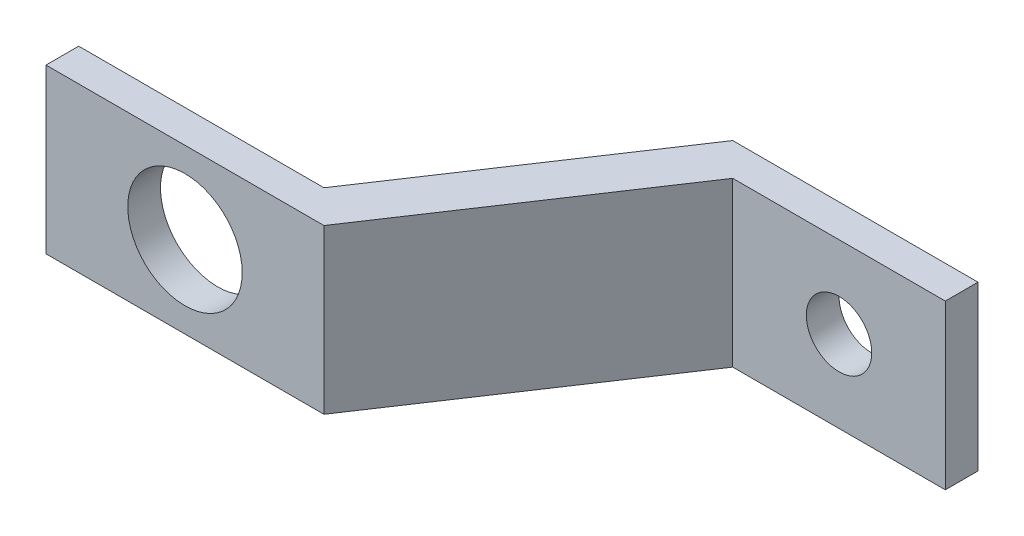
ISO-10303-21;
HEADER;
FILE_DESCRIPTION(('STEP AP214'),'2;1');
FILE_NAME('part.step','',(''),(''),'','','');
FILE_SCHEMA(('AUTOMOTIVE_DESIGN { 1 0 10303 214 1 1 1 1 }'));
ENDSEC;
DATA;
#1=APPLICATION_CONTEXT('core data for automotive mechanical design processes');
#2=APPLICATION_PROTOCOL_DEFINITION('international standard','automotive_design',2000,#1);
#3=PRODUCT_CONTEXT('',#1,'mechanical');
#4=PRODUCT('Part','Part','',(#3));
#5=PRODUCT_RELATED_PRODUCT_CATEGORY('part','',(#4));
#6=PRODUCT_DEFINITION_FORMATION('','',#4);
#7=PRODUCT_DEFINITION_CONTEXT('part definition',#1,'design');
#8=PRODUCT_DEFINITION('design','',#6,#7);
#9=PRODUCT_DEFINITION_SHAPE('','',#8);
#10=(LENGTH_UNIT() NAMED_UNIT(*) SI_UNIT(.MILLI.,.METRE.));
#11=(NAMED_UNIT(*) PLANE_ANGLE_UNIT() SI_UNIT($,.RADIAN.));
#12=(NAMED_UNIT(*) SI_UNIT($,.STERADIAN.) SOLID_ANGLE_UNIT());
#13=UNCERTAINTY_MEASURE_WITH_UNIT(LENGTH_MEASURE(1.E-05),#10,'distance_accuracy_value','');
#14=(GEOMETRIC_REPRESENTATION_CONTEXT(3) GLOBAL_UNCERTAINTY_ASSIGNED_CONTEXT((#13)) GLOBAL_UNIT_ASSIGNED_CONTEXT((#10,
#11,#12)) REPRESENTATION_CONTEXT('',''));
#15=CARTESIAN_POINT('',(0.,0.,0.));
#16=DIRECTION('',(0.,0.,1.));
#17=DIRECTION('',(1.,0.,0.));
#18=AXIS2_PLACEMENT_3D('',#15,#16,#17);
#19=CARTESIAN_POINT('',(0.,10.,2.));
#20=DIRECTION('',(1.,0.,0.));
#21=DIRECTION('',(0.,0.,-1.));
#22=AXIS2_PLACEMENT_3D('',#19,#20,#21);
#23=PLANE('',#22);
#24=DIRECTION('',(0.,0.,1.));
#25=VECTOR('',#24,1.);
#26=CARTESIAN_POINT('',(0.,0.,2.));
#27=LINE('',#26,#25);
#28=CARTESIAN_POINT('',(0.,0.,0.));
#29=VERTEX_POINT('',#28);
#30=CARTESIAN_POINT('',(0.,0.,2.));
#31=VERTEX_POINT('',#30);
#32=EDGE_CURVE('E140',#29,#31,#27,.T.);
#33=ORIENTED_EDGE('',*,*,#32,.T.);
#34=DIRECTION('',(0.,-1.,0.));
#35=VECTOR('',#34,1.);
#36=CARTESIAN_POINT('',(0.,10.,2.));
#37=LINE('',#36,#35);
#38=CARTESIAN_POINT('',(0.,10.,2.));
#39=VERTEX_POINT('',#38);
#40=EDGE_CURVE('E11',#39,#31,#37,.T.);
#41=ORIENTED_EDGE('',*,*,#40,.F.);
#42=DIRECTION('',(0.,0.,1.));
#43=VECTOR('',#42,1.);
#44=CARTESIAN_POINT('',(0.,10.,2.));
#45=LINE('',#44,#43);
#46=CARTESIAN_POINT('',(0.,10.,0.));
#47=VERTEX_POINT('',#46);
#48=EDGE_CURVE('E155',#47,#39,#45,.T.);
#49=ORIENTED_EDGE('',*,*,#48,.F.);
#50=DIRECTION('',(0.,-1.,0.));
#51=VECTOR('',#50,1.);
#52=CARTESIAN_POINT('',(0.,10.,0.));
#53=LINE('',#52,#51);
#54=EDGE_CURVE('E133',#47,#29,#53,.T.);
#55=ORIENTED_EDGE('',*,*,#54,.T.);
#56=EDGE_LOOP('',(#33,#41,#49,#55));
#57=FACE_BOUND('',#56,.T.);
#58=ADVANCED_FACE('F39',(#57),#23,.F.);
#59=CARTESIAN_POINT('',(17.,10.,2.));
#60=DIRECTION('',(0.,0.,-1.));
#61=DIRECTION('',(-1.,0.,0.));
#62=AXIS2_PLACEMENT_3D('',#59,#60,#61);
#63=PLANE('',#62);
#64=CARTESIAN_POINT('',(8.5,5.,2.));
#65=DIRECTION('',(0.,0.,1.));
#66=DIRECTION('',(1.,0.,0.));
#67=AXIS2_PLACEMENT_3D('',#64,#65,#66);
#68=CIRCLE('',#67,3.5);
#69=CARTESIAN_POINT('',(12.,5.,2.));
#70=VERTEX_POINT('',#69);
#71=EDGE_CURVE('E161',#70,#70,#68,.T.);
#72=ORIENTED_EDGE('',*,*,#71,.F.);
#73=EDGE_LOOP('',(#72));
#74=FACE_BOUND('',#73,.T.);
#75=DIRECTION('',(1.,0.,0.));
#76=VECTOR('',#75,1.);
#77=CARTESIAN_POINT('',(17.,0.,2.));
#78=LINE('',#77,#76);
#79=CARTESIAN_POINT('',(17.,0.,2.));
#80=VERTEX_POINT('',#79);
#81=EDGE_CURVE('E139',#31,#80,#78,.T.);
#82=ORIENTED_EDGE('',*,*,#81,.T.);
#83=DIRECTION('',(0.,-1.,0.));
#84=VECTOR('',#83,1.);
#85=CARTESIAN_POINT('',(17.,10.,2.));
#86=LINE('',#85,#84);
#87=CARTESIAN_POINT('',(17.,10.,2.));
#88=VERTEX_POINT('',#87);
#89=EDGE_CURVE('E48',#88,#80,#86,.T.);
#90=ORIENTED_EDGE('',*,*,#89,.F.);
#91=DIRECTION('',(1.,0.,0.));
#92=VECTOR('',#91,1.);
#93=CARTESIAN_POINT('',(17.,10.,2.));
#94=LINE('',#93,#92);
#95=EDGE_CURVE('E99',#39,#88,#94,.T.);
#96=ORIENTED_EDGE('',*,*,#95,.F.);
#97=ORIENTED_EDGE('',*,*,#40,.T.);
#98=EDGE_LOOP('',(#82,#90,#96,#97));
#99=FACE_BOUND('',#98,.T.);
#100=ADVANCED_FACE('F213',(#74,#99),#63,.F.);
#101=CARTESIAN_POINT('',(27.,10.,-13.));
#102=DIRECTION('',(-0.832050294337844,0.,-0.554700196225229));
#103=DIRECTION('',(-0.554700196225229,0.,0.832050294337844));
#104=AXIS2_PLACEMENT_3D('',#101,#102,#103);
#105=PLANE('',#104);
#106=DIRECTION('',(0.554700196225229,0.,-0.832050294337844));
#107=VECTOR('',#106,1.);
#108=CARTESIAN_POINT('',(27.,0.,-13.));
#109=LINE('',#108,#107);
#110=CARTESIAN_POINT('',(27.,0.,-13.));
#111=VERTEX_POINT('',#110);
#112=EDGE_CURVE('E142',#80,#111,#109,.T.);
#113=ORIENTED_EDGE('',*,*,#112,.T.);
#114=DIRECTION('',(0.,-1.,0.));
#115=VECTOR('',#114,1.);
#116=CARTESIAN_POINT('',(27.,10.,-13.));
#117=LINE('',#116,#115);
#118=CARTESIAN_POINT('',(27.,10.,-13.));
#119=VERTEX_POINT('',#118);
#120=EDGE_CURVE('E159',#119,#111,#117,.T.);
#121=ORIENTED_EDGE('',*,*,#120,.F.);
#122=DIRECTION('',(0.554700196225229,0.,-0.832050294337844));
#123=VECTOR('',#122,1.);
#124=CARTESIAN_POINT('',(27.,10.,-13.));
#125=LINE('',#124,#123);
#126=EDGE_CURVE('E178',#88,#119,#125,.T.);
#127=ORIENTED_EDGE('',*,*,#126,.F.);
#128=ORIENTED_EDGE('',*,*,#89,.T.);
#129=EDGE_LOOP('',(#113,#121,#127,#128));
#130=FACE_BOUND('',#129,.T.);
#131=ADVANCED_FACE('F218',(#130),#105,.F.);
#132=CARTESIAN_POINT('',(40.,10.,-13.));
#133=DIRECTION('',(0.,0.,-1.));
#134=DIRECTION('',(-1.,0.,0.));
#135=AXIS2_PLACEMENT_3D('',#132,#133,#134);
#136=PLANE('',#135);
#137=CARTESIAN_POINT('',(33.5,5.,-13.));
#138=DIRECTION('',(0.,0.,-1.));
#139=DIRECTION('',(-1.,0.,0.));
#140=AXIS2_PLACEMENT_3D('',#137,#138,#139);
#141=CIRCLE('',#140,2.);
#142=CARTESIAN_POINT('',(31.5,5.,-13.));
#143=VERTEX_POINT('',#142);
#144=EDGE_CURVE('E141',#143,#143,#141,.T.);
#145=ORIENTED_EDGE('',*,*,#144,.T.);
#146=EDGE_LOOP('',(#145));
#147=FACE_BOUND('',#146,.T.);
#148=DIRECTION('',(1.,0.,0.));
#149=VECTOR('',#148,1.);
#150=CARTESIAN_POINT('',(40.,0.,-13.));
#151=LINE('',#150,#149);
#152=CARTESIAN_POINT('',(40.,0.,-13.));
#153=VERTEX_POINT('',#152);
#154=EDGE_CURVE('E144',#111,#153,#151,.T.);
#155=ORIENTED_EDGE('',*,*,#154,.T.);
#156=DIRECTION('',(0.,-1.,0.));
#157=VECTOR('',#156,1.);
#158=CARTESIAN_POINT('',(40.,10.,-13.));
#159=LINE('',#158,#157);
#160=CARTESIAN_POINT('',(40.,10.,-13.));
#161=VERTEX_POINT('',#160);
#162=EDGE_CURVE('E157',#161,#153,#159,.T.);
#163=ORIENTED_EDGE('',*,*,#162,.F.);
#164=DIRECTION('',(1.,0.,0.));
#165=VECTOR('',#164,1.);
#166=CARTESIAN_POINT('',(40.,10.,-13.));
#167=LINE('',#166,#165);
#168=EDGE_CURVE('E179',#119,#161,#167,.T.);
#169=ORIENTED_EDGE('',*,*,#168,.F.);
#170=ORIENTED_EDGE('',*,*,#120,.T.);
#171=EDGE_LOOP('',(#155,#163,#169,#170));
#172=FACE_BOUND('',#171,.T.);
#173=ADVANCED_FACE('F186',(#147,#172),#136,.F.);
#174=CARTESIAN_POINT('',(40.,10.,-15.));
#175=DIRECTION('',(-1.,0.,0.));
#176=DIRECTION('',(0.,0.,1.));
#177=AXIS2_PLACEMENT_3D('',#174,#175,#176);
#178=PLANE('',#177);
#179=DIRECTION('',(0.,0.,-1.));
#180=VECTOR('',#179,1.);
#181=CARTESIAN_POINT('',(40.,0.,-15.));
#182=LINE('',#181,#180);
#183=CARTESIAN_POINT('',(40.,0.,-15.));
#184=VERTEX_POINT('',#183);
#185=EDGE_CURVE('E150',#153,#184,#182,.T.);
#186=ORIENTED_EDGE('',*,*,#185,.T.);
#187=DIRECTION('',(0.,-1.,0.));
#188=VECTOR('',#187,1.);
#189=CARTESIAN_POINT('',(40.,10.,-15.));
#190=LINE('',#189,#188);
#191=CARTESIAN_POINT('',(40.,10.,-15.));
#192=VERTEX_POINT('',#191);
#193=EDGE_CURVE('E126',#192,#184,#190,.T.);
#194=ORIENTED_EDGE('',*,*,#193,.F.);
#195=DIRECTION('',(0.,0.,-1.));
#196=VECTOR('',#195,1.);
#197=CARTESIAN_POINT('',(40.,10.,-15.));
#198=LINE('',#197,#196);
#199=EDGE_CURVE('E119',#161,#192,#198,.T.);
#200=ORIENTED_EDGE('',*,*,#199,.F.);
#201=ORIENTED_EDGE('',*,*,#162,.T.);
#202=EDGE_LOOP('',(#186,#194,#200,#201));
#203=FACE_BOUND('',#202,.T.);
#204=ADVANCED_FACE('F189',(#203),#178,.F.);
#205=CARTESIAN_POINT('',(25.,10.,-15.));
#206=DIRECTION('',(0.,0.,1.));
#207=DIRECTION('',(1.,0.,0.));
#208=AXIS2_PLACEMENT_3D('',#205,#206,#207);
#209=PLANE('',#208);
#210=CARTESIAN_POINT('',(33.5,5.,-15.));
#211=DIRECTION('',(0.,0.,1.));
#212=DIRECTION('',(1.,0.,0.));
#213=AXIS2_PLACEMENT_3D('',#210,#211,#212);
#214=CIRCLE('',#213,2.);
#215=CARTESIAN_POINT('',(35.5,5.,-15.));
#216=VERTEX_POINT('',#215);
#217=EDGE_CURVE('E45',#216,#216,#214,.T.);
#218=ORIENTED_EDGE('',*,*,#217,.T.);
#219=EDGE_LOOP('',(#218));
#220=FACE_BOUND('',#219,.T.);
#221=DIRECTION('',(-1.,0.,0.));
#222=VECTOR('',#221,1.);
#223=CARTESIAN_POINT('',(25.,0.,-15.));
#224=LINE('',#223,#222);
#225=CARTESIAN_POINT('',(25.,0.,-15.));
#226=VERTEX_POINT('',#225);
#227=EDGE_CURVE('E130',#184,#226,#224,.T.);
#228=ORIENTED_EDGE('',*,*,#227,.T.);
#229=DIRECTION('',(0.,-1.,0.));
#230=VECTOR('',#229,1.);
#231=CARTESIAN_POINT('',(25.,10.,-15.));
#232=LINE('',#231,#230);
#233=CARTESIAN_POINT('',(25.,10.,-15.));
#234=VERTEX_POINT('',#233);
#235=EDGE_CURVE('E125',#234,#226,#232,.T.);
#236=ORIENTED_EDGE('',*,*,#235,.F.);
#237=DIRECTION('',(-1.,0.,0.));
#238=VECTOR('',#237,1.);
#239=CARTESIAN_POINT('',(25.,10.,-15.));
#240=LINE('',#239,#238);
#241=EDGE_CURVE('E111',#192,#234,#240,.T.);
#242=ORIENTED_EDGE('',*,*,#241,.F.);
#243=ORIENTED_EDGE('',*,*,#193,.T.);
#244=EDGE_LOOP('',(#228,#236,#242,#243));
#245=FACE_BOUND('',#244,.T.);
#246=ADVANCED_FACE('F124',(#220,#245),#209,.F.);
#247=CARTESIAN_POINT('',(15.,10.,0.));
#248=DIRECTION('',(0.832050294337844,0.,0.554700196225229));
#249=DIRECTION('',(0.554700196225229,0.,-0.832050294337844));
#250=AXIS2_PLACEMENT_3D('',#247,#248,#249);
#251=PLANE('',#250);
#252=DIRECTION('',(-0.554700196225229,0.,0.832050294337844));
#253=VECTOR('',#252,1.);
#254=CARTESIAN_POINT('',(15.,0.,0.));
#255=LINE('',#254,#253);
#256=CARTESIAN_POINT('',(15.,0.,0.));
#257=VERTEX_POINT('',#256);
#258=EDGE_CURVE('E86',#226,#257,#255,.T.);
#259=ORIENTED_EDGE('',*,*,#258,.T.);
#260=DIRECTION('',(0.,-1.,0.));
#261=VECTOR('',#260,1.);
#262=CARTESIAN_POINT('',(15.,10.,0.));
#263=LINE('',#262,#261);
#264=CARTESIAN_POINT('',(15.,10.,0.));
#265=VERTEX_POINT('',#264);
#266=EDGE_CURVE('E129',#265,#257,#263,.T.);
#267=ORIENTED_EDGE('',*,*,#266,.F.);
#268=DIRECTION('',(-0.554700196225229,0.,0.832050294337844));
#269=VECTOR('',#268,1.);
#270=CARTESIAN_POINT('',(15.,10.,0.));
#271=LINE('',#270,#269);
#272=EDGE_CURVE('E120',#234,#265,#271,.T.);
#273=ORIENTED_EDGE('',*,*,#272,.F.);
#274=ORIENTED_EDGE('',*,*,#235,.T.);
#275=EDGE_LOOP('',(#259,#267,#273,#274));
#276=FACE_BOUND('',#275,.T.);
#277=ADVANCED_FACE('F131',(#276),#251,.F.);
#278=CARTESIAN_POINT('',(0.,10.,0.));
#279=DIRECTION('',(0.,0.,1.));
#280=DIRECTION('',(1.,0.,0.));
#281=AXIS2_PLACEMENT_3D('',#278,#279,#280);
#282=PLANE('',#281);
#283=CARTESIAN_POINT('',(8.5,5.,0.));
#284=DIRECTION('',(0.,0.,1.));
#285=DIRECTION('',(1.,0.,0.));
#286=AXIS2_PLACEMENT_3D('',#283,#284,#285);
#287=CIRCLE('',#286,3.5);
#288=CARTESIAN_POINT('',(12.,5.,0.));
#289=VERTEX_POINT('',#288);
#290=EDGE_CURVE('E163',#289,#289,#287,.T.);
#291=ORIENTED_EDGE('',*,*,#290,.T.);
#292=EDGE_LOOP('',(#291));
#293=FACE_BOUND('',#292,.T.);
#294=DIRECTION('',(-1.,0.,0.));
#295=VECTOR('',#294,1.);
#296=CARTESIAN_POINT('',(0.,0.,0.));
#297=LINE('',#296,#295);
#298=EDGE_CURVE('E95',#257,#29,#297,.T.);
#299=ORIENTED_EDGE('',*,*,#298,.T.);
#300=ORIENTED_EDGE('',*,*,#54,.F.);
#301=DIRECTION('',(-1.,0.,0.));
#302=VECTOR('',#301,1.);
#303=CARTESIAN_POINT('',(0.,10.,0.));
#304=LINE('',#303,#302);
#305=EDGE_CURVE('E60',#265,#47,#304,.T.);
#306=ORIENTED_EDGE('',*,*,#305,.F.);
#307=ORIENTED_EDGE('',*,*,#266,.T.);
#308=EDGE_LOOP('',(#299,#300,#306,#307));
#309=FACE_BOUND('',#308,.T.);
#310=ADVANCED_FACE('F198',(#293,#309),#282,.F.);
#311=CARTESIAN_POINT('',(0.,10.,0.));
#312=DIRECTION('',(0.,-1.,0.));
#313=DIRECTION('',(0.,0.,-1.));
#314=AXIS2_PLACEMENT_3D('',#311,#312,#313);
#315=PLANE('',#314);
#316=ORIENTED_EDGE('',*,*,#48,.T.);
#317=ORIENTED_EDGE('',*,*,#95,.T.);
#318=ORIENTED_EDGE('',*,*,#126,.T.);
#319=ORIENTED_EDGE('',*,*,#168,.T.);
#320=ORIENTED_EDGE('',*,*,#199,.T.);
#321=ORIENTED_EDGE('',*,*,#241,.T.);
#322=ORIENTED_EDGE('',*,*,#272,.T.);
#323=ORIENTED_EDGE('',*,*,#305,.T.);
#324=EDGE_LOOP('',(#316,#317,#318,#319,#320,#321,#322,#323));
#325=FACE_BOUND('',#324,.T.);
#326=ADVANCED_FACE('F113',(#325),#315,.F.);
#327=CARTESIAN_POINT('',(0.,0.,0.));
#328=DIRECTION('',(0.,-1.,0.));
#329=DIRECTION('',(0.,0.,-1.));
#330=AXIS2_PLACEMENT_3D('',#327,#328,#329);
#331=PLANE('',#330);
#332=ORIENTED_EDGE('',*,*,#32,.F.);
#333=ORIENTED_EDGE('',*,*,#298,.F.);
#334=ORIENTED_EDGE('',*,*,#258,.F.);
#335=ORIENTED_EDGE('',*,*,#227,.F.);
#336=ORIENTED_EDGE('',*,*,#185,.F.);
#337=ORIENTED_EDGE('',*,*,#154,.F.);
#338=ORIENTED_EDGE('',*,*,#112,.F.);
#339=ORIENTED_EDGE('',*,*,#81,.F.);
#340=EDGE_LOOP('',(#332,#333,#334,#335,#336,#337,#338,#339));
#341=FACE_BOUND('',#340,.T.);
#342=ADVANCED_FACE('F194',(#341),#331,.T.);
#343=CARTESIAN_POINT('',(8.5,5.,-28.));
#344=DIRECTION('',(0.,0.,1.));
#345=DIRECTION('',(1.,0.,0.));
#346=AXIS2_PLACEMENT_3D('',#343,#344,#345);
#347=CYLINDRICAL_SURFACE('',#346,3.5);
#348=ORIENTED_EDGE('',*,*,#71,.T.);
#349=EDGE_LOOP('',(#348));
#350=FACE_BOUND('',#349,.T.);
#351=ORIENTED_EDGE('',*,*,#290,.F.);
#352=EDGE_LOOP('',(#351));
#353=FACE_BOUND('',#352,.T.);
#354=ADVANCED_FACE('F240',(#350,#353),#347,.F.);
#355=CARTESIAN_POINT('',(33.5,5.,-28.));
#356=DIRECTION('',(0.,0.,1.));
#357=DIRECTION('',(1.,0.,0.));
#358=AXIS2_PLACEMENT_3D('',#355,#356,#357);
#359=CYLINDRICAL_SURFACE('',#358,2.);
#360=ORIENTED_EDGE('',*,*,#217,.F.);
#361=EDGE_LOOP('',(#360));
#362=FACE_BOUND('',#361,.T.);
#363=ORIENTED_EDGE('',*,*,#144,.F.);
#364=EDGE_LOOP('',(#363));
#365=FACE_BOUND('',#364,.T.);
#366=ADVANCED_FACE('F233',(#362,#365),#359,.F.);
#367=CLOSED_SHELL('',(#58,#100,#131,#173,#204,#246,#277,#310,#326,#342,#354,#366));
#368=MANIFOLD_SOLID_BREP('B2',#367);
#369=ADVANCED_BREP_SHAPE_REPRESENTATION('',(#18,#368),#14);
#370=SHAPE_DEFINITION_REPRESENTATION(#9,#369);
ENDSEC;
END-ISO-10303-21;
